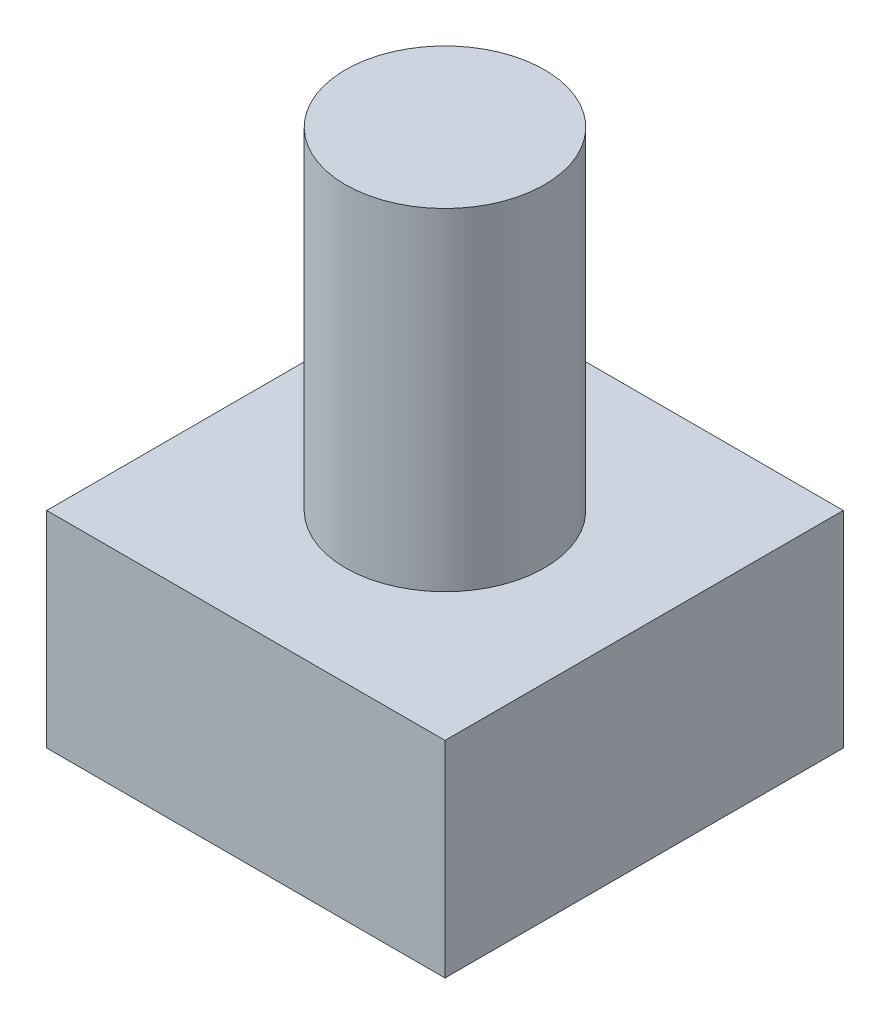
ISO-10303-21;
HEADER;
FILE_DESCRIPTION(('STEP AP214'),'2;1');
FILE_NAME('part.step','',(''),(''),'','','');
FILE_SCHEMA(('AUTOMOTIVE_DESIGN { 1 0 10303 214 1 1 1 1 }'));
ENDSEC;
DATA;
#1=APPLICATION_CONTEXT('core data for automotive mechanical design processes');
#2=APPLICATION_PROTOCOL_DEFINITION('international standard','automotive_design',2000,#1);
#3=PRODUCT_CONTEXT('',#1,'mechanical');
#4=PRODUCT('Part','Part','',(#3));
#5=PRODUCT_RELATED_PRODUCT_CATEGORY('part','',(#4));
#6=PRODUCT_DEFINITION_FORMATION('','',#4);
#7=PRODUCT_DEFINITION_CONTEXT('part definition',#1,'design');
#8=PRODUCT_DEFINITION('design','',#6,#7);
#9=PRODUCT_DEFINITION_SHAPE('','',#8);
#10=(LENGTH_UNIT() NAMED_UNIT(*) SI_UNIT(.MILLI.,.METRE.));
#11=(NAMED_UNIT(*) PLANE_ANGLE_UNIT() SI_UNIT($,.RADIAN.));
#12=(NAMED_UNIT(*) SI_UNIT($,.STERADIAN.) SOLID_ANGLE_UNIT());
#13=UNCERTAINTY_MEASURE_WITH_UNIT(LENGTH_MEASURE(1.E-05),#10,'distance_accuracy_value','');
#14=(GEOMETRIC_REPRESENTATION_CONTEXT(3) GLOBAL_UNCERTAINTY_ASSIGNED_CONTEXT((#13)) GLOBAL_UNIT_ASSIGNED_CONTEXT((#10,
#11,#12)) REPRESENTATION_CONTEXT('',''));
#15=CARTESIAN_POINT('',(0.,0.,0.));
#16=DIRECTION('',(0.,0.,1.));
#17=DIRECTION('',(1.,0.,0.));
#18=AXIS2_PLACEMENT_3D('',#15,#16,#17);
#19=CARTESIAN_POINT('',(-3.,3.1,2.99999999999999));
#20=DIRECTION('',(0.,1.,0.));
#21=DIRECTION('',(0.,0.,1.));
#22=AXIS2_PLACEMENT_3D('',#19,#20,#21);
#23=PLANE('',#22);
#24=DIRECTION('',(0.,0.,1.));
#25=VECTOR('',#24,1.);
#26=CARTESIAN_POINT('',(-3.,3.1,-3.00000000000001));
#27=LINE('',#26,#25);
#28=CARTESIAN_POINT('',(-3.,3.1,-3.00000000000001));
#29=VERTEX_POINT('',#28);
#30=CARTESIAN_POINT('',(-3.,3.1,2.99999999999999));
#31=VERTEX_POINT('',#30);
#32=EDGE_CURVE('E100',#29,#31,#27,.T.);
#33=ORIENTED_EDGE('',*,*,#32,.T.);
#34=DIRECTION('',(1.,0.,0.));
#35=VECTOR('',#34,1.);
#36=CARTESIAN_POINT('',(-3.,3.1,2.99999999999999));
#37=LINE('',#36,#35);
#38=CARTESIAN_POINT('',(3.00000000000002,3.1,2.99999999999999));
#39=VERTEX_POINT('',#38);
#40=EDGE_CURVE('E85',#31,#39,#37,.T.);
#41=ORIENTED_EDGE('',*,*,#40,.T.);
#42=DIRECTION('',(0.,0.,-1.));
#43=VECTOR('',#42,1.);
#44=CARTESIAN_POINT('',(3.,3.1,-3.00000000000001));
#45=LINE('',#44,#43);
#46=CARTESIAN_POINT('',(3.,3.1,-3.00000000000001));
#47=VERTEX_POINT('',#46);
#48=EDGE_CURVE('E52',#39,#47,#45,.T.);
#49=ORIENTED_EDGE('',*,*,#48,.T.);
#50=DIRECTION('',(-1.,0.,0.));
#51=VECTOR('',#50,1.);
#52=CARTESIAN_POINT('',(-3.,3.1,-3.00000000000001));
#53=LINE('',#52,#51);
#54=EDGE_CURVE('E47',#47,#29,#53,.T.);
#55=ORIENTED_EDGE('',*,*,#54,.T.);
#56=EDGE_LOOP('',(#33,#41,#49,#55));
#57=FACE_BOUND('',#56,.T.);
#58=CARTESIAN_POINT('',(0.,3.1,0.));
#59=DIRECTION('',(0.,1.,0.));
#60=DIRECTION('',(0.,0.,1.));
#61=AXIS2_PLACEMENT_3D('',#58,#59,#60);
#62=CIRCLE('',#61,1.5);
#63=CARTESIAN_POINT('',(0.,3.1,1.5));
#64=VERTEX_POINT('',#63);
#65=EDGE_CURVE('E93',#64,#64,#62,.T.);
#66=ORIENTED_EDGE('',*,*,#65,.F.);
#67=EDGE_LOOP('',(#66));
#68=FACE_BOUND('',#67,.T.);
#69=ADVANCED_FACE('F32',(#57,#68),#23,.T.);
#70=CARTESIAN_POINT('',(-3.,3.1,-3.00000000000001));
#71=DIRECTION('',(1.,0.,0.));
#72=DIRECTION('',(0.,0.,-1.));
#73=AXIS2_PLACEMENT_3D('',#70,#71,#72);
#74=PLANE('',#73);
#75=DIRECTION('',(0.,0.,1.));
#76=VECTOR('',#75,1.);
#77=CARTESIAN_POINT('',(-3.,0.,-3.00000000000001));
#78=LINE('',#77,#76);
#79=CARTESIAN_POINT('',(-3.,0.,-3.00000000000001));
#80=VERTEX_POINT('',#79);
#81=CARTESIAN_POINT('',(-3.,0.,2.99999999999999));
#82=VERTEX_POINT('',#81);
#83=EDGE_CURVE('E77',#80,#82,#78,.T.);
#84=ORIENTED_EDGE('',*,*,#83,.T.);
#85=DIRECTION('',(0.,-1.,0.));
#86=VECTOR('',#85,1.);
#87=CARTESIAN_POINT('',(-3.,3.1,2.99999999999999));
#88=LINE('',#87,#86);
#89=EDGE_CURVE('E11',#31,#82,#88,.T.);
#90=ORIENTED_EDGE('',*,*,#89,.F.);
#91=ORIENTED_EDGE('',*,*,#32,.F.);
#92=DIRECTION('',(0.,-1.,0.));
#93=VECTOR('',#92,1.);
#94=CARTESIAN_POINT('',(-3.,3.1,-3.00000000000001));
#95=LINE('',#94,#93);
#96=EDGE_CURVE('E89',#29,#80,#95,.T.);
#97=ORIENTED_EDGE('',*,*,#96,.T.);
#98=EDGE_LOOP('',(#84,#90,#91,#97));
#99=FACE_BOUND('',#98,.T.);
#100=ADVANCED_FACE('F34',(#99),#74,.F.);
#101=CARTESIAN_POINT('',(-3.,3.1,2.99999999999999));
#102=DIRECTION('',(0.,0.,-1.));
#103=DIRECTION('',(-1.,0.,0.));
#104=AXIS2_PLACEMENT_3D('',#101,#102,#103);
#105=PLANE('',#104);
#106=DIRECTION('',(1.,0.,0.));
#107=VECTOR('',#106,1.);
#108=CARTESIAN_POINT('',(-3.,0.,2.99999999999999));
#109=LINE('',#108,#107);
#110=CARTESIAN_POINT('',(3.00000000000002,0.,2.99999999999999));
#111=VERTEX_POINT('',#110);
#112=EDGE_CURVE('E73',#82,#111,#109,.T.);
#113=ORIENTED_EDGE('',*,*,#112,.T.);
#114=DIRECTION('',(0.,-1.,0.));
#115=VECTOR('',#114,1.);
#116=CARTESIAN_POINT('',(3.00000000000002,3.1,2.99999999999999));
#117=LINE('',#116,#115);
#118=EDGE_CURVE('E40',#39,#111,#117,.T.);
#119=ORIENTED_EDGE('',*,*,#118,.F.);
#120=ORIENTED_EDGE('',*,*,#40,.F.);
#121=ORIENTED_EDGE('',*,*,#89,.T.);
#122=EDGE_LOOP('',(#113,#119,#120,#121));
#123=FACE_BOUND('',#122,.T.);
#124=ADVANCED_FACE('F84',(#123),#105,.F.);
#125=CARTESIAN_POINT('',(3.,3.1,-3.00000000000001));
#126=DIRECTION('',(-1.,0.,0.));
#127=DIRECTION('',(0.,0.,1.));
#128=AXIS2_PLACEMENT_3D('',#125,#126,#127);
#129=PLANE('',#128);
#130=DIRECTION('',(0.,0.,-1.));
#131=VECTOR('',#130,1.);
#132=CARTESIAN_POINT('',(3.,0.,-3.00000000000001));
#133=LINE('',#132,#131);
#134=CARTESIAN_POINT('',(3.,0.,-3.00000000000001));
#135=VERTEX_POINT('',#134);
#136=EDGE_CURVE('E78',#111,#135,#133,.T.);
#137=ORIENTED_EDGE('',*,*,#136,.T.);
#138=DIRECTION('',(0.,-1.,0.));
#139=VECTOR('',#138,1.);
#140=CARTESIAN_POINT('',(3.,3.1,-3.00000000000001));
#141=LINE('',#140,#139);
#142=EDGE_CURVE('E106',#47,#135,#141,.T.);
#143=ORIENTED_EDGE('',*,*,#142,.F.);
#144=ORIENTED_EDGE('',*,*,#48,.F.);
#145=ORIENTED_EDGE('',*,*,#118,.T.);
#146=EDGE_LOOP('',(#137,#143,#144,#145));
#147=FACE_BOUND('',#146,.T.);
#148=ADVANCED_FACE('F109',(#147),#129,.F.);
#149=CARTESIAN_POINT('',(-3.,3.1,-3.00000000000001));
#150=DIRECTION('',(0.,0.,1.));
#151=DIRECTION('',(1.,0.,0.));
#152=AXIS2_PLACEMENT_3D('',#149,#150,#151);
#153=PLANE('',#152);
#154=DIRECTION('',(-1.,0.,0.));
#155=VECTOR('',#154,1.);
#156=CARTESIAN_POINT('',(-3.,0.,-3.00000000000001));
#157=LINE('',#156,#155);
#158=EDGE_CURVE('E98',#135,#80,#157,.T.);
#159=ORIENTED_EDGE('',*,*,#158,.T.);
#160=ORIENTED_EDGE('',*,*,#96,.F.);
#161=ORIENTED_EDGE('',*,*,#54,.F.);
#162=ORIENTED_EDGE('',*,*,#142,.T.);
#163=EDGE_LOOP('',(#159,#160,#161,#162));
#164=FACE_BOUND('',#163,.T.);
#165=ADVANCED_FACE('F111',(#164),#153,.F.);
#166=CARTESIAN_POINT('',(-3.,0.,2.99999999999999));
#167=DIRECTION('',(0.,1.,0.));
#168=DIRECTION('',(0.,0.,1.));
#169=AXIS2_PLACEMENT_3D('',#166,#167,#168);
#170=PLANE('',#169);
#171=ORIENTED_EDGE('',*,*,#83,.F.);
#172=ORIENTED_EDGE('',*,*,#158,.F.);
#173=ORIENTED_EDGE('',*,*,#136,.F.);
#174=ORIENTED_EDGE('',*,*,#112,.F.);
#175=EDGE_LOOP('',(#171,#172,#173,#174));
#176=FACE_BOUND('',#175,.T.);
#177=ADVANCED_FACE('F74',(#176),#170,.F.);
#178=CARTESIAN_POINT('',(0.,8.1,0.));
#179=DIRECTION('',(0.,-1.,0.));
#180=DIRECTION('',(0.,0.,-1.));
#181=AXIS2_PLACEMENT_3D('',#178,#179,#180);
#182=CYLINDRICAL_SURFACE('',#181,1.5);
#183=CARTESIAN_POINT('',(0.,8.1,0.));
#184=DIRECTION('',(0.,1.,0.));
#185=DIRECTION('',(0.,0.,1.));
#186=AXIS2_PLACEMENT_3D('',#183,#184,#185);
#187=CIRCLE('',#186,1.5);
#188=CARTESIAN_POINT('',(0.,8.1,1.5));
#189=VERTEX_POINT('',#188);
#190=EDGE_CURVE('E90',#189,#189,#187,.T.);
#191=ORIENTED_EDGE('',*,*,#190,.F.);
#192=EDGE_LOOP('',(#191));
#193=FACE_BOUND('',#192,.T.);
#194=ORIENTED_EDGE('',*,*,#65,.T.);
#195=EDGE_LOOP('',(#194));
#196=FACE_BOUND('',#195,.T.);
#197=ADVANCED_FACE('F118',(#193,#196),#182,.T.);
#198=CARTESIAN_POINT('',(0.,8.1,0.));
#199=DIRECTION('',(0.,1.,0.));
#200=DIRECTION('',(0.,0.,1.));
#201=AXIS2_PLACEMENT_3D('',#198,#199,#200);
#202=PLANE('',#201);
#203=ORIENTED_EDGE('',*,*,#190,.T.);
#204=EDGE_LOOP('',(#203));
#205=FACE_BOUND('',#204,.T.);
#206=ADVANCED_FACE('F120',(#205),#202,.T.);
#207=CLOSED_SHELL('',(#69,#100,#124,#148,#165,#177,#197,#206));
#208=MANIFOLD_SOLID_BREP('B2',#207);
#209=ADVANCED_BREP_SHAPE_REPRESENTATION('',(#18,#208),#14);
#210=SHAPE_DEFINITION_REPRESENTATION(#9,#209);
ENDSEC;
END-ISO-10303-21;
